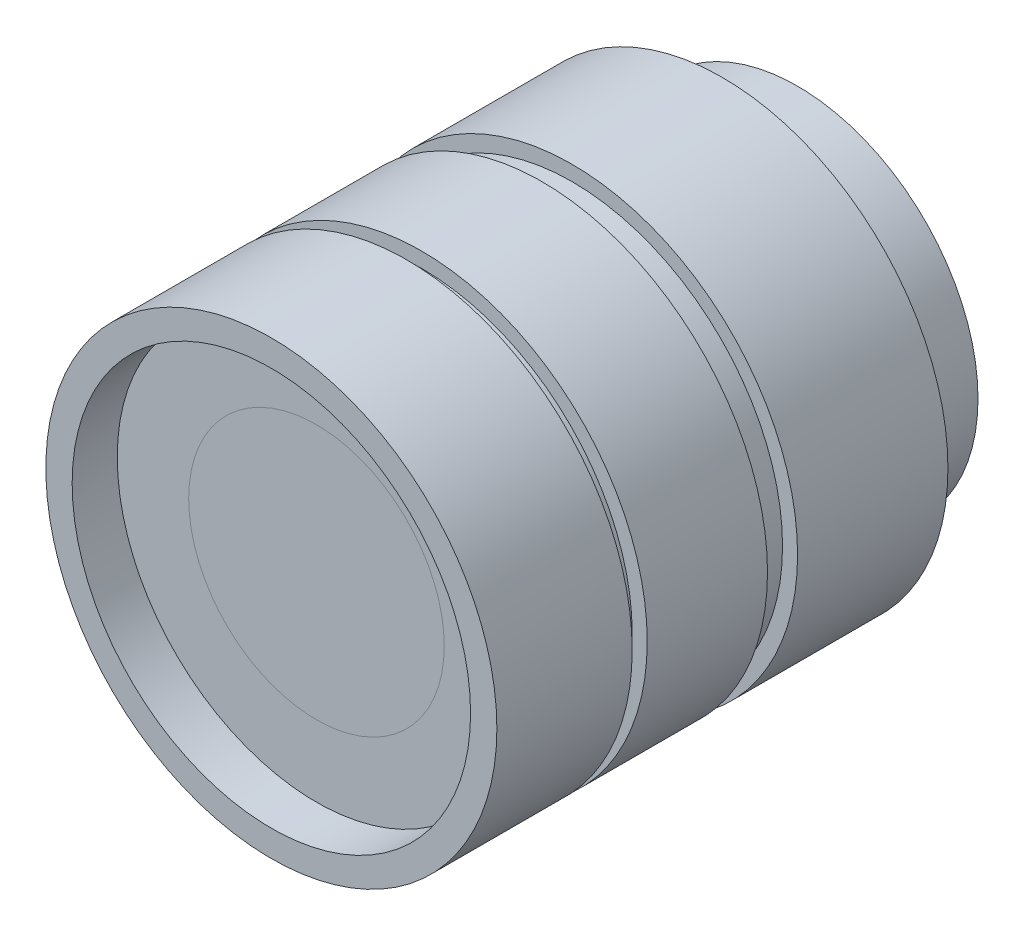
ISO-10303-21;
HEADER;
FILE_DESCRIPTION(('STEP AP214'),'2;1');
FILE_NAME('part.step','',(''),(''),'','','');
FILE_SCHEMA(('AUTOMOTIVE_DESIGN { 1 0 10303 214 1 1 1 1 }'));
ENDSEC;
DATA;
#1=APPLICATION_CONTEXT('core data for automotive mechanical design processes');
#2=APPLICATION_PROTOCOL_DEFINITION('international standard','automotive_design',2000,#1);
#3=PRODUCT_CONTEXT('',#1,'mechanical');
#4=PRODUCT('Part','Part','',(#3));
#5=PRODUCT_RELATED_PRODUCT_CATEGORY('part','',(#4));
#6=PRODUCT_DEFINITION_FORMATION('','',#4);
#7=PRODUCT_DEFINITION_CONTEXT('part definition',#1,'design');
#8=PRODUCT_DEFINITION('design','',#6,#7);
#9=PRODUCT_DEFINITION_SHAPE('','',#8);
#10=(LENGTH_UNIT() NAMED_UNIT(*) SI_UNIT(.MILLI.,.METRE.));
#11=(NAMED_UNIT(*) PLANE_ANGLE_UNIT() SI_UNIT($,.RADIAN.));
#12=(NAMED_UNIT(*) SI_UNIT($,.STERADIAN.) SOLID_ANGLE_UNIT());
#13=UNCERTAINTY_MEASURE_WITH_UNIT(LENGTH_MEASURE(1.E-05),#10,'distance_accuracy_value','');
#14=(GEOMETRIC_REPRESENTATION_CONTEXT(3) GLOBAL_UNCERTAINTY_ASSIGNED_CONTEXT((#13)) GLOBAL_UNIT_ASSIGNED_CONTEXT((#10,
#11,#12)) REPRESENTATION_CONTEXT('',''));
#15=CARTESIAN_POINT('',(0.,0.,0.));
#16=DIRECTION('',(0.,0.,1.));
#17=DIRECTION('',(1.,0.,0.));
#18=AXIS2_PLACEMENT_3D('',#15,#16,#17);
#19=CARTESIAN_POINT('',(0.,0.,-5.));
#20=DIRECTION('',(0.,0.,1.));
#21=DIRECTION('',(1.,0.,0.));
#22=AXIS2_PLACEMENT_3D('',#19,#20,#21);
#23=CYLINDRICAL_SURFACE('',#22,12.);
#24=CARTESIAN_POINT('',(0.,0.,-5.));
#25=DIRECTION('',(0.,0.,-1.));
#26=DIRECTION('',(-1.,0.,0.));
#27=AXIS2_PLACEMENT_3D('',#24,#25,#26);
#28=CIRCLE('',#27,12.);
#29=CARTESIAN_POINT('',(-12.,0.,-5.));
#30=VERTEX_POINT('',#29);
#31=EDGE_CURVE('E11',#30,#30,#28,.T.);
#32=ORIENTED_EDGE('',*,*,#31,.F.);
#33=EDGE_LOOP('',(#32));
#34=FACE_BOUND('',#33,.T.);
#35=CARTESIAN_POINT('',(0.,0.,0.));
#36=DIRECTION('',(0.,0.,-1.));
#37=DIRECTION('',(-1.,0.,0.));
#38=AXIS2_PLACEMENT_3D('',#35,#36,#37);
#39=CIRCLE('',#38,12.);
#40=CARTESIAN_POINT('',(-12.,0.,0.));
#41=VERTEX_POINT('',#40);
#42=EDGE_CURVE('E51',#41,#41,#39,.T.);
#43=ORIENTED_EDGE('',*,*,#42,.T.);
#44=EDGE_LOOP('',(#43));
#45=FACE_BOUND('',#44,.T.);
#46=ADVANCED_FACE('F48',(#34,#45),#23,.T.);
#47=CARTESIAN_POINT('',(0.,0.,-5.));
#48=DIRECTION('',(0.,0.,-1.));
#49=DIRECTION('',(-1.,0.,0.));
#50=AXIS2_PLACEMENT_3D('',#47,#48,#49);
#51=PLANE('',#50);
#52=ORIENTED_EDGE('',*,*,#31,.T.);
#53=EDGE_LOOP('',(#52));
#54=FACE_BOUND('',#53,.T.);
#55=ADVANCED_FACE('F63',(#54),#51,.T.);
#56=CARTESIAN_POINT('',(0.,0.,0.));
#57=DIRECTION('',(0.,0.,-1.));
#58=DIRECTION('',(-1.,0.,0.));
#59=AXIS2_PLACEMENT_3D('',#56,#57,#58);
#60=PLANE('',#59);
#61=ORIENTED_EDGE('',*,*,#42,.F.);
#62=EDGE_LOOP('',(#61));
#63=FACE_BOUND('',#62,.T.);
#64=ADVANCED_FACE('F61',(#63),#60,.F.);
#65=CLOSED_SHELL('',(#46,#55,#64));
#66=MANIFOLD_SOLID_BREP('B2',#65);
#67=CARTESIAN_POINT('',(0.,0.,27.));
#68=DIRECTION('',(0.,0.,1.));
#69=DIRECTION('',(1.,0.,0.));
#70=AXIS2_PLACEMENT_3D('',#67,#68,#69);
#71=PLANE('',#70);
#72=CARTESIAN_POINT('',(0.,0.,27.));
#73=DIRECTION('',(0.,0.,1.));
#74=DIRECTION('',(1.,0.,0.));
#75=AXIS2_PLACEMENT_3D('',#72,#73,#74);
#76=CIRCLE('',#75,13.25);
#77=CARTESIAN_POINT('',(13.25,0.,27.));
#78=VERTEX_POINT('',#77);
#79=EDGE_CURVE('E303',#78,#78,#76,.T.);
#80=ORIENTED_EDGE('',*,*,#79,.T.);
#81=EDGE_LOOP('',(#80));
#82=FACE_BOUND('',#81,.T.);
#83=CARTESIAN_POINT('',(0.,0.,27.));
#84=DIRECTION('',(0.,0.,1.));
#85=DIRECTION('',(1.,0.,0.));
#86=AXIS2_PLACEMENT_3D('',#83,#84,#85);
#87=CIRCLE('',#86,8.5);
#88=CARTESIAN_POINT('',(8.5,0.,27.));
#89=VERTEX_POINT('',#88);
#90=EDGE_CURVE('E47',#89,#89,#87,.F.);
#91=ORIENTED_EDGE('',*,*,#90,.T.);
#92=EDGE_LOOP('',(#91));
#93=FACE_BOUND('',#92,.T.);
#94=ADVANCED_FACE('F88',(#82,#93),#71,.T.);
#95=CARTESIAN_POINT('',(0.,0.,10.));
#96=DIRECTION('',(0.,0.,-1.));
#97=DIRECTION('',(-1.,0.,0.));
#98=AXIS2_PLACEMENT_3D('',#95,#96,#97);
#99=CYLINDRICAL_SURFACE('',#98,15.);
#100=CARTESIAN_POINT('',(0.,0.,10.));
#101=DIRECTION('',(0.,0.,1.));
#102=DIRECTION('',(1.,0.,0.));
#103=AXIS2_PLACEMENT_3D('',#100,#101,#102);
#104=CIRCLE('',#103,15.);
#105=CARTESIAN_POINT('',(15.,0.,10.));
#106=VERTEX_POINT('',#105);
#107=EDGE_CURVE('E107',#106,#106,#104,.T.);
#108=ORIENTED_EDGE('',*,*,#107,.F.);
#109=EDGE_LOOP('',(#108));
#110=FACE_BOUND('',#109,.T.);
#111=CARTESIAN_POINT('',(0.,0.,0.));
#112=DIRECTION('',(0.,0.,1.));
#113=DIRECTION('',(1.,0.,0.));
#114=AXIS2_PLACEMENT_3D('',#111,#112,#113);
#115=CIRCLE('',#114,15.);
#116=CARTESIAN_POINT('',(15.,0.,0.));
#117=VERTEX_POINT('',#116);
#118=EDGE_CURVE('E121',#117,#117,#115,.T.);
#119=ORIENTED_EDGE('',*,*,#118,.T.);
#120=EDGE_LOOP('',(#119));
#121=FACE_BOUND('',#120,.T.);
#122=ADVANCED_FACE('F90',(#110,#121),#99,.T.);
#123=CARTESIAN_POINT('',(0.,0.,10.));
#124=DIRECTION('',(0.,0.,1.));
#125=DIRECTION('',(1.,0.,0.));
#126=AXIS2_PLACEMENT_3D('',#123,#124,#125);
#127=PLANE('',#126);
#128=CARTESIAN_POINT('',(0.,0.,10.));
#129=DIRECTION('',(0.,0.,1.));
#130=DIRECTION('',(1.,0.,0.));
#131=AXIS2_PLACEMENT_3D('',#128,#129,#130);
#132=CIRCLE('',#131,14.);
#133=CARTESIAN_POINT('',(14.,0.,10.));
#134=VERTEX_POINT('',#133);
#135=EDGE_CURVE('E102',#134,#134,#132,.T.);
#136=ORIENTED_EDGE('',*,*,#135,.F.);
#137=EDGE_LOOP('',(#136));
#138=FACE_BOUND('',#137,.T.);
#139=ORIENTED_EDGE('',*,*,#107,.T.);
#140=EDGE_LOOP('',(#139));
#141=FACE_BOUND('',#140,.T.);
#142=ADVANCED_FACE('F131',(#138,#141),#127,.T.);
#143=CARTESIAN_POINT('',(0.,0.,0.));
#144=DIRECTION('',(0.,0.,1.));
#145=DIRECTION('',(1.,0.,0.));
#146=AXIS2_PLACEMENT_3D('',#143,#144,#145);
#147=PLANE('',#146);
#148=ORIENTED_EDGE('',*,*,#118,.F.);
#149=EDGE_LOOP('',(#148));
#150=FACE_BOUND('',#149,.T.);
#151=ADVANCED_FACE('F128',(#150),#147,.F.);
#152=CARTESIAN_POINT('',(0.,0.,12.));
#153=DIRECTION('',(0.,0.,-1.));
#154=DIRECTION('',(-1.,0.,0.));
#155=AXIS2_PLACEMENT_3D('',#152,#153,#154);
#156=CYLINDRICAL_SURFACE('',#155,14.);
#157=CARTESIAN_POINT('',(0.,0.,12.));
#158=DIRECTION('',(0.,0.,1.));
#159=DIRECTION('',(1.,0.,0.));
#160=AXIS2_PLACEMENT_3D('',#157,#158,#159);
#161=CIRCLE('',#160,14.);
#162=CARTESIAN_POINT('',(14.,0.,12.));
#163=VERTEX_POINT('',#162);
#164=EDGE_CURVE('E116',#163,#163,#161,.T.);
#165=ORIENTED_EDGE('',*,*,#164,.F.);
#166=EDGE_LOOP('',(#165));
#167=FACE_BOUND('',#166,.T.);
#168=ORIENTED_EDGE('',*,*,#135,.T.);
#169=EDGE_LOOP('',(#168));
#170=FACE_BOUND('',#169,.T.);
#171=ADVANCED_FACE('F130',(#167,#170),#156,.T.);
#172=CARTESIAN_POINT('',(0.,0.,20.));
#173=DIRECTION('',(0.,0.,-1.));
#174=DIRECTION('',(-1.,0.,0.));
#175=AXIS2_PLACEMENT_3D('',#172,#173,#174);
#176=CYLINDRICAL_SURFACE('',#175,15.);
#177=CARTESIAN_POINT('',(0.,0.,20.));
#178=DIRECTION('',(0.,0.,1.));
#179=DIRECTION('',(1.,0.,0.));
#180=AXIS2_PLACEMENT_3D('',#177,#178,#179);
#181=CIRCLE('',#180,15.);
#182=CARTESIAN_POINT('',(15.,0.,20.));
#183=VERTEX_POINT('',#182);
#184=EDGE_CURVE('E113',#183,#183,#181,.T.);
#185=ORIENTED_EDGE('',*,*,#184,.F.);
#186=EDGE_LOOP('',(#185));
#187=FACE_BOUND('',#186,.T.);
#188=CARTESIAN_POINT('',(0.,0.,12.));
#189=DIRECTION('',(0.,0.,1.));
#190=DIRECTION('',(1.,0.,0.));
#191=AXIS2_PLACEMENT_3D('',#188,#189,#190);
#192=CIRCLE('',#191,15.);
#193=CARTESIAN_POINT('',(15.,0.,12.));
#194=VERTEX_POINT('',#193);
#195=EDGE_CURVE('E117',#194,#194,#192,.T.);
#196=ORIENTED_EDGE('',*,*,#195,.T.);
#197=EDGE_LOOP('',(#196));
#198=FACE_BOUND('',#197,.T.);
#199=ADVANCED_FACE('F136',(#187,#198),#176,.T.);
#200=CARTESIAN_POINT('',(0.,0.,20.));
#201=DIRECTION('',(0.,0.,1.));
#202=DIRECTION('',(1.,0.,0.));
#203=AXIS2_PLACEMENT_3D('',#200,#201,#202);
#204=PLANE('',#203);
#205=CARTESIAN_POINT('',(0.,0.,20.));
#206=DIRECTION('',(0.,0.,1.));
#207=DIRECTION('',(1.,0.,0.));
#208=AXIS2_PLACEMENT_3D('',#205,#206,#207);
#209=CIRCLE('',#208,14.);
#210=CARTESIAN_POINT('',(14.,0.,20.));
#211=VERTEX_POINT('',#210);
#212=EDGE_CURVE('E96',#211,#211,#209,.T.);
#213=ORIENTED_EDGE('',*,*,#212,.F.);
#214=EDGE_LOOP('',(#213));
#215=FACE_BOUND('',#214,.T.);
#216=ORIENTED_EDGE('',*,*,#184,.T.);
#217=EDGE_LOOP('',(#216));
#218=FACE_BOUND('',#217,.T.);
#219=ADVANCED_FACE('F180',(#215,#218),#204,.T.);
#220=CARTESIAN_POINT('',(0.,0.,12.));
#221=DIRECTION('',(0.,0.,1.));
#222=DIRECTION('',(1.,0.,0.));
#223=AXIS2_PLACEMENT_3D('',#220,#221,#222);
#224=PLANE('',#223);
#225=ORIENTED_EDGE('',*,*,#164,.T.);
#226=EDGE_LOOP('',(#225));
#227=FACE_BOUND('',#226,.T.);
#228=ORIENTED_EDGE('',*,*,#195,.F.);
#229=EDGE_LOOP('',(#228));
#230=FACE_BOUND('',#229,.T.);
#231=ADVANCED_FACE('F178',(#227,#230),#224,.F.);
#232=CARTESIAN_POINT('',(0.,0.,21.));
#233=DIRECTION('',(0.,0.,-1.));
#234=DIRECTION('',(-1.,0.,0.));
#235=AXIS2_PLACEMENT_3D('',#232,#233,#234);
#236=CYLINDRICAL_SURFACE('',#235,14.);
#237=CARTESIAN_POINT('',(0.,0.,21.));
#238=DIRECTION('',(0.,0.,1.));
#239=DIRECTION('',(1.,0.,0.));
#240=AXIS2_PLACEMENT_3D('',#237,#238,#239);
#241=CIRCLE('',#240,14.);
#242=CARTESIAN_POINT('',(14.,0.,21.));
#243=VERTEX_POINT('',#242);
#244=EDGE_CURVE('E111',#243,#243,#241,.T.);
#245=ORIENTED_EDGE('',*,*,#244,.F.);
#246=EDGE_LOOP('',(#245));
#247=FACE_BOUND('',#246,.T.);
#248=ORIENTED_EDGE('',*,*,#212,.T.);
#249=EDGE_LOOP('',(#248));
#250=FACE_BOUND('',#249,.T.);
#251=ADVANCED_FACE('F174',(#247,#250),#236,.T.);
#252=CARTESIAN_POINT('',(0.,0.,30.));
#253=DIRECTION('',(0.,0.,-1.));
#254=DIRECTION('',(-1.,0.,0.));
#255=AXIS2_PLACEMENT_3D('',#252,#253,#254);
#256=CYLINDRICAL_SURFACE('',#255,15.);
#257=CARTESIAN_POINT('',(0.,0.,30.));
#258=DIRECTION('',(0.,0.,1.));
#259=DIRECTION('',(1.,0.,0.));
#260=AXIS2_PLACEMENT_3D('',#257,#258,#259);
#261=CIRCLE('',#260,15.);
#262=CARTESIAN_POINT('',(15.,0.,30.));
#263=VERTEX_POINT('',#262);
#264=EDGE_CURVE('E296',#263,#263,#261,.T.);
#265=ORIENTED_EDGE('',*,*,#264,.F.);
#266=EDGE_LOOP('',(#265));
#267=FACE_BOUND('',#266,.T.);
#268=CARTESIAN_POINT('',(0.,0.,21.));
#269=DIRECTION('',(0.,0.,1.));
#270=DIRECTION('',(1.,0.,0.));
#271=AXIS2_PLACEMENT_3D('',#268,#269,#270);
#272=CIRCLE('',#271,15.);
#273=CARTESIAN_POINT('',(15.,0.,21.));
#274=VERTEX_POINT('',#273);
#275=EDGE_CURVE('E298',#274,#274,#272,.T.);
#276=ORIENTED_EDGE('',*,*,#275,.T.);
#277=EDGE_LOOP('',(#276));
#278=FACE_BOUND('',#277,.T.);
#279=ADVANCED_FACE('F169',(#267,#278),#256,.T.);
#280=CARTESIAN_POINT('',(0.,0.,30.));
#281=DIRECTION('',(0.,0.,1.));
#282=DIRECTION('',(1.,0.,0.));
#283=AXIS2_PLACEMENT_3D('',#280,#281,#282);
#284=PLANE('',#283);
#285=CARTESIAN_POINT('',(0.,0.,30.));
#286=DIRECTION('',(0.,0.,1.));
#287=DIRECTION('',(1.,0.,0.));
#288=AXIS2_PLACEMENT_3D('',#285,#286,#287);
#289=CIRCLE('',#288,13.25);
#290=CARTESIAN_POINT('',(13.25,0.,30.));
#291=VERTEX_POINT('',#290);
#292=EDGE_CURVE('E305',#291,#291,#289,.T.);
#293=ORIENTED_EDGE('',*,*,#292,.F.);
#294=EDGE_LOOP('',(#293));
#295=FACE_BOUND('',#294,.T.);
#296=ORIENTED_EDGE('',*,*,#264,.T.);
#297=EDGE_LOOP('',(#296));
#298=FACE_BOUND('',#297,.T.);
#299=ADVANCED_FACE('F162',(#295,#298),#284,.T.);
#300=CARTESIAN_POINT('',(0.,0.,21.));
#301=DIRECTION('',(0.,0.,1.));
#302=DIRECTION('',(1.,0.,0.));
#303=AXIS2_PLACEMENT_3D('',#300,#301,#302);
#304=PLANE('',#303);
#305=ORIENTED_EDGE('',*,*,#244,.T.);
#306=EDGE_LOOP('',(#305));
#307=FACE_BOUND('',#306,.T.);
#308=ORIENTED_EDGE('',*,*,#275,.F.);
#309=EDGE_LOOP('',(#308));
#310=FACE_BOUND('',#309,.T.);
#311=ADVANCED_FACE('F157',(#307,#310),#304,.F.);
#312=CARTESIAN_POINT('',(0.,0.,27.));
#313=DIRECTION('',(0.,0.,1.));
#314=DIRECTION('',(1.,0.,0.));
#315=AXIS2_PLACEMENT_3D('',#312,#313,#314);
#316=CYLINDRICAL_SURFACE('',#315,13.25);
#317=ORIENTED_EDGE('',*,*,#79,.F.);
#318=EDGE_LOOP('',(#317));
#319=FACE_BOUND('',#318,.T.);
#320=ORIENTED_EDGE('',*,*,#292,.T.);
#321=EDGE_LOOP('',(#320));
#322=FACE_BOUND('',#321,.T.);
#323=ADVANCED_FACE('F152',(#319,#322),#316,.F.);
#324=ORIENTED_EDGE('',*,*,#90,.F.);
#325=EDGE_LOOP('',(#324));
#326=FACE_BOUND('',#325,.T.);
#327=ADVANCED_FACE('F144',(#326),#71,.T.);
#328=CLOSED_SHELL('',(#94,#122,#142,#151,#171,#199,#219,#231,#251,#279,#299,#311,#323,#327));
#329=MANIFOLD_SOLID_BREP('B6',#328);
#330=ADVANCED_BREP_SHAPE_REPRESENTATION('',(#18,#66,#329),#14);
#331=SHAPE_DEFINITION_REPRESENTATION(#9,#330);
ENDSEC;
END-ISO-10303-21;
